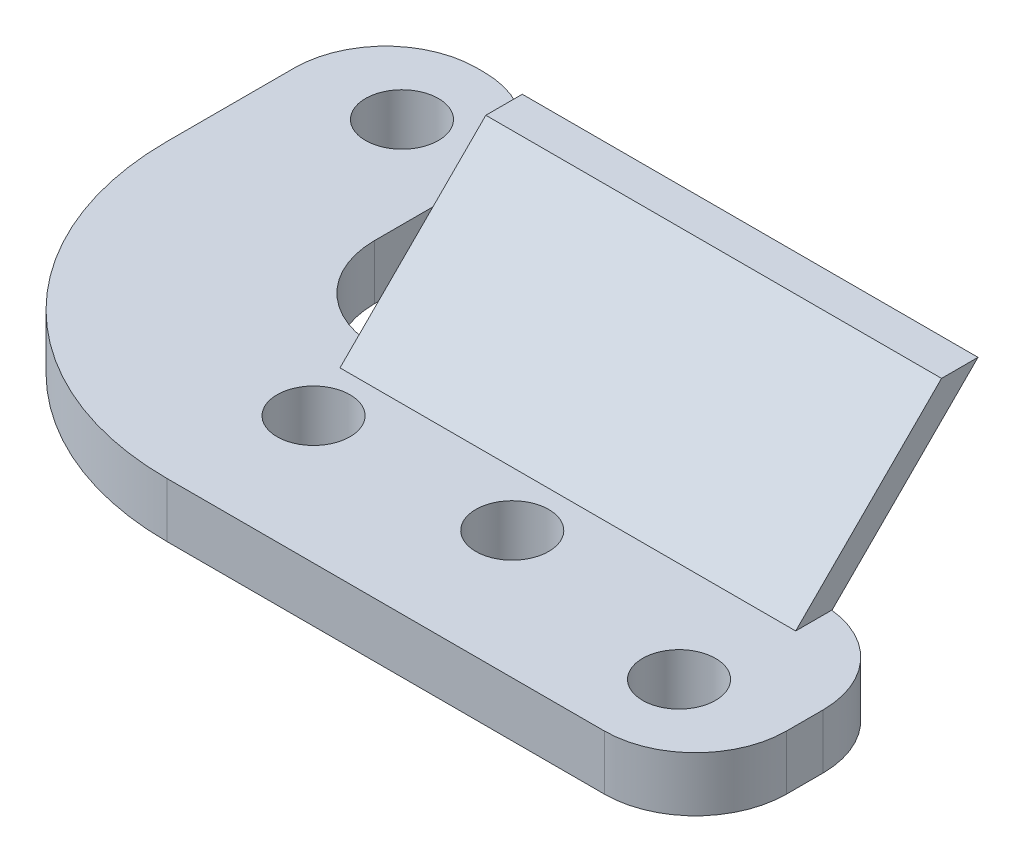
ISO-10303-21;
HEADER;
FILE_DESCRIPTION(('STEP AP214'),'2;1');
FILE_NAME('part.step','',(''),(''),'','','');
FILE_SCHEMA(('AUTOMOTIVE_DESIGN { 1 0 10303 214 1 1 1 1 }'));
ENDSEC;
DATA;
#1=APPLICATION_CONTEXT('core data for automotive mechanical design processes');
#2=APPLICATION_PROTOCOL_DEFINITION('international standard','automotive_design',2000,#1);
#3=PRODUCT_CONTEXT('',#1,'mechanical');
#4=PRODUCT('Part','Part','',(#3));
#5=PRODUCT_RELATED_PRODUCT_CATEGORY('part','',(#4));
#6=PRODUCT_DEFINITION_FORMATION('','',#4);
#7=PRODUCT_DEFINITION_CONTEXT('part definition',#1,'design');
#8=PRODUCT_DEFINITION('design','',#6,#7);
#9=PRODUCT_DEFINITION_SHAPE('','',#8);
#10=(LENGTH_UNIT() NAMED_UNIT(*) SI_UNIT(.MILLI.,.METRE.));
#11=(NAMED_UNIT(*) PLANE_ANGLE_UNIT() SI_UNIT($,.RADIAN.));
#12=(NAMED_UNIT(*) SI_UNIT($,.STERADIAN.) SOLID_ANGLE_UNIT());
#13=UNCERTAINTY_MEASURE_WITH_UNIT(LENGTH_MEASURE(1.E-05),#10,'distance_accuracy_value','');
#14=(GEOMETRIC_REPRESENTATION_CONTEXT(3) GLOBAL_UNCERTAINTY_ASSIGNED_CONTEXT((#13)) GLOBAL_UNIT_ASSIGNED_CONTEXT((#10,
#11,#12)) REPRESENTATION_CONTEXT('',''));
#15=CARTESIAN_POINT('',(0.,0.,0.));
#16=DIRECTION('',(0.,0.,1.));
#17=DIRECTION('',(1.,0.,0.));
#18=AXIS2_PLACEMENT_3D('',#15,#16,#17);
#19=CARTESIAN_POINT('',(-12.1,0.,2.00000000000001));
#20=DIRECTION('',(0.,0.,1.));
#21=DIRECTION('',(1.,0.,0.));
#22=AXIS2_PLACEMENT_3D('',#19,#20,#21);
#23=PLANE('',#22);
#24=DIRECTION('',(1.,0.,0.));
#25=VECTOR('',#24,1.);
#26=CARTESIAN_POINT('',(-7.,3.,2.00000000000001));
#27=LINE('',#26,#25);
#28=CARTESIAN_POINT('',(-7.,3.,2.00000000000001));
#29=VERTEX_POINT('',#28);
#30=CARTESIAN_POINT('',(-1.375813040851,3.,2.00000000000001));
#31=VERTEX_POINT('',#30);
#32=EDGE_CURVE('E82',#29,#31,#27,.T.);
#33=ORIENTED_EDGE('',*,*,#32,.T.);
#34=CARTESIAN_POINT('',(-1.375813040851,3.,2.00000000000001));
#35=CARTESIAN_POINT('',(-1.43730327936802,2.9467502376009,2.00000000000001));
#36=CARTESIAN_POINT('',(-1.49896624544466,2.89370015322512,2.00000000000001));
#37=CARTESIAN_POINT('',(-1.62269554283787,2.78806795498701,2.00000000000001));
#38=CARTESIAN_POINT('',(-1.68476188912119,2.7354858586621,2.00000000000001));
#39=CARTESIAN_POINT('',(-1.87176730969761,2.57844852926436,2.00000000000001));
#40=CARTESIAN_POINT('',(-1.99739320548546,2.47480625783929,2.00000000000001));
#41=CARTESIAN_POINT('',(-2.25565181792562,2.26685375995626,2.00000000000001));
#42=CARTESIAN_POINT('',(-2.38837387775181,2.16265411093397,2.00000000000001));
#43=CARTESIAN_POINT('',(-2.6573767435479,1.95900296490191,2.00000000000001));
#44=CARTESIAN_POINT('',(-2.79365608174645,1.85954955599163,2.00000000000001));
#45=CARTESIAN_POINT('',(-3.01361588240625,1.70775774880954,2.00000000000001));
#46=CARTESIAN_POINT('',(-3.09562812177616,1.65301023933813,2.00000000000001));
#47=CARTESIAN_POINT('',(-3.26180234747498,1.54682957224514,2.00000000000001));
#48=CARTESIAN_POINT('',(-3.34596458259755,1.49539680064729,2.00000000000001));
#49=CARTESIAN_POINT('',(-3.51563898672004,1.39769989904045,2.00000000000001));
#50=CARTESIAN_POINT('',(-3.60111389872318,1.35137164926032,2.00000000000001));
#51=CARTESIAN_POINT('',(-3.77503341759313,1.26457361944343,2.00000000000001));
#52=CARTESIAN_POINT('',(-3.86347774711878,1.22410329414625,2.00000000000001));
#53=CARTESIAN_POINT('',(-4.02321455226724,1.15938694586495,2.00000000000001));
#54=CARTESIAN_POINT('',(-4.09385302884763,1.13354247541662,2.00000000000001));
#55=CARTESIAN_POINT('',(-4.23697720310679,1.08780784222922,2.00000000000001));
#56=CARTESIAN_POINT('',(-4.30946084039725,1.06791132915132,2.00000000000001));
#57=CARTESIAN_POINT('',(-4.4576044312165,1.03490924589325,2.00000000000001));
#58=CARTESIAN_POINT('',(-4.53329911076626,1.02195443334035,2.00000000000001));
#59=CARTESIAN_POINT('',(-4.64769742110917,1.0088551409767,2.00000000000001));
#60=CARTESIAN_POINT('',(-4.68605474313612,1.00554394956792,2.00000000000001));
#61=CARTESIAN_POINT('',(-4.76290984945479,1.00111282569035,2.00000000000001));
#62=CARTESIAN_POINT('',(-4.80140768145761,0.999993723900384,2.00000000000001));
#63=CARTESIAN_POINT('',(-4.8399146559888,0.999999999999985,2.00000000000001));
#64=B_SPLINE_CURVE_WITH_KNOTS('',3,(#34,#35,#36,#37,#38,#39,#40,#41,#42,#43,#44,#45,#46,#47,#48,
#49,#50,#51,#52,#53,#54,#55,#56,#57,#58,#59,#60,#61,#62,#63),.UNSPECIFIED.,.F.,.F.,(4,2,2,2,2,2,
2,2,2,2,2,2,2,2,4),(0.,0.244026124703903,0.488061355871686,0.976607160337992,1.48276241738857,
1.98871203141778,2.28447498290611,2.58027231598975,2.87178153626228,3.16326360514428,
3.38870589795084,3.6139066304692,3.8438180738404,3.95926195802243,4.07474958049561),.UNSPECIFIED.);
#65=CARTESIAN_POINT('',(-4.8399146559888,0.999999999999986,2.00000000000001));
#66=VERTEX_POINT('',#65);
#67=EDGE_CURVE('E52',#31,#66,#64,.T.);
#68=ORIENTED_EDGE('',*,*,#67,.T.);
#69=DIRECTION('',(0.,1.,0.));
#70=VECTOR('',#69,1.);
#71=CARTESIAN_POINT('',(-4.8399146559888,0.,2.00000000000001));
#72=LINE('',#71,#70);
#73=CARTESIAN_POINT('',(-4.8399146559888,0.,2.00000000000001));
#74=VERTEX_POINT('',#73);
#75=EDGE_CURVE('E107',#66,#74,#72,.F.);
#76=ORIENTED_EDGE('',*,*,#75,.T.);
#77=DIRECTION('',(1.,0.,0.));
#78=VECTOR('',#77,1.);
#79=CARTESIAN_POINT('',(-12.1,0.,2.00000000000001));
#80=LINE('',#79,#78);
#81=CARTESIAN_POINT('',(-7.1,0.,2.00000000000001));
#82=VERTEX_POINT('',#81);
#83=EDGE_CURVE('E570',#82,#74,#80,.T.);
#84=ORIENTED_EDGE('',*,*,#83,.F.);
#85=DIRECTION('',(0.,1.,0.));
#86=VECTOR('',#85,1.);
#87=CARTESIAN_POINT('',(-7.1,3.,2.00000000000001));
#88=LINE('',#87,#86);
#89=CARTESIAN_POINT('',(-7.1,3.,2.00000000000001));
#90=VERTEX_POINT('',#89);
#91=EDGE_CURVE('E500',#82,#90,#88,.T.);
#92=ORIENTED_EDGE('',*,*,#91,.T.);
#93=DIRECTION('',(1.,0.,0.));
#94=VECTOR('',#93,1.);
#95=CARTESIAN_POINT('',(-12.1,3.,2.00000000000001));
#96=LINE('',#95,#94);
#97=EDGE_CURVE('E571',#90,#29,#96,.T.);
#98=ORIENTED_EDGE('',*,*,#97,.T.);
#99=EDGE_LOOP('',(#33,#68,#76,#84,#92,#98));
#100=FACE_BOUND('',#99,.T.);
#101=ADVANCED_FACE('F37',(#100),#23,.F.);
#102=CARTESIAN_POINT('',(-22.5,3.,14.));
#103=DIRECTION('',(1.,0.,0.));
#104=DIRECTION('',(0.,0.,-1.));
#105=AXIS2_PLACEMENT_3D('',#102,#103,#104);
#106=PLANE('',#105);
#107=DIRECTION('',(0.,0.,1.));
#108=VECTOR('',#107,1.);
#109=CARTESIAN_POINT('',(-22.5,0.,14.));
#110=LINE('',#109,#108);
#111=CARTESIAN_POINT('',(-22.5,0.,-8.99999999999999));
#112=VERTEX_POINT('',#111);
#113=CARTESIAN_POINT('',(-22.5,0.,-2.));
#114=VERTEX_POINT('',#113);
#115=EDGE_CURVE('E533',#112,#114,#110,.T.);
#116=ORIENTED_EDGE('',*,*,#115,.T.);
#117=DIRECTION('',(0.,-1.,0.));
#118=VECTOR('',#117,1.);
#119=CARTESIAN_POINT('',(-22.5,3.,-2.));
#120=LINE('',#119,#118);
#121=CARTESIAN_POINT('',(-22.5,3.,-2.));
#122=VERTEX_POINT('',#121);
#123=EDGE_CURVE('E453',#114,#122,#120,.F.);
#124=ORIENTED_EDGE('',*,*,#123,.T.);
#125=DIRECTION('',(0.,0.,1.));
#126=VECTOR('',#125,1.);
#127=CARTESIAN_POINT('',(-22.5,3.,14.));
#128=LINE('',#127,#126);
#129=CARTESIAN_POINT('',(-22.5,3.,-8.99999999999999));
#130=VERTEX_POINT('',#129);
#131=EDGE_CURVE('E526',#130,#122,#128,.T.);
#132=ORIENTED_EDGE('',*,*,#131,.F.);
#133=DIRECTION('',(0.,-1.,0.));
#134=VECTOR('',#133,1.);
#135=CARTESIAN_POINT('',(-22.5,3.,-8.99999999999999));
#136=LINE('',#135,#134);
#137=EDGE_CURVE('E480',#130,#112,#136,.T.);
#138=ORIENTED_EDGE('',*,*,#137,.T.);
#139=EDGE_LOOP('',(#116,#124,#132,#138));
#140=FACE_BOUND('',#139,.T.);
#141=ADVANCED_FACE('F223',(#140),#106,.F.);
#142=CARTESIAN_POINT('',(22.5,3.,14.));
#143=DIRECTION('',(0.,0.,-1.));
#144=DIRECTION('',(-1.,0.,0.));
#145=AXIS2_PLACEMENT_3D('',#142,#143,#144);
#146=PLANE('',#145);
#147=DIRECTION('',(1.,0.,0.));
#148=VECTOR('',#147,1.);
#149=CARTESIAN_POINT('',(22.5,3.,14.));
#150=LINE('',#149,#148);
#151=CARTESIAN_POINT('',(-6.49999999999998,3.,14.));
#152=VERTEX_POINT('',#151);
#153=CARTESIAN_POINT('',(17.5,3.,14.));
#154=VERTEX_POINT('',#153);
#155=EDGE_CURVE('E542',#152,#154,#150,.T.);
#156=ORIENTED_EDGE('',*,*,#155,.F.);
#157=DIRECTION('',(0.,-1.,0.));
#158=VECTOR('',#157,1.);
#159=CARTESIAN_POINT('',(-6.49999999999999,3.,14.));
#160=LINE('',#159,#158);
#161=CARTESIAN_POINT('',(-6.49999999999998,0.,14.));
#162=VERTEX_POINT('',#161);
#163=EDGE_CURVE('E459',#152,#162,#160,.T.);
#164=ORIENTED_EDGE('',*,*,#163,.T.);
#165=DIRECTION('',(1.,0.,0.));
#166=VECTOR('',#165,1.);
#167=CARTESIAN_POINT('',(22.5,0.,14.));
#168=LINE('',#167,#166);
#169=CARTESIAN_POINT('',(17.5,0.,14.));
#170=VERTEX_POINT('',#169);
#171=EDGE_CURVE('E530',#162,#170,#168,.T.);
#172=ORIENTED_EDGE('',*,*,#171,.T.);
#173=DIRECTION('',(0.,-1.,0.));
#174=VECTOR('',#173,1.);
#175=CARTESIAN_POINT('',(17.5,3.,14.));
#176=LINE('',#175,#174);
#177=EDGE_CURVE('E483',#170,#154,#176,.F.);
#178=ORIENTED_EDGE('',*,*,#177,.T.);
#179=EDGE_LOOP('',(#156,#164,#172,#178));
#180=FACE_BOUND('',#179,.T.);
#181=ADVANCED_FACE('F226',(#180),#146,.F.);
#182=CARTESIAN_POINT('',(22.5,3.,14.));
#183=DIRECTION('',(-1.,0.,0.));
#184=DIRECTION('',(0.,0.,1.));
#185=AXIS2_PLACEMENT_3D('',#182,#183,#184);
#186=PLANE('',#185);
#187=DIRECTION('',(0.,0.,-1.));
#188=VECTOR('',#187,1.);
#189=CARTESIAN_POINT('',(22.5,0.,14.));
#190=LINE('',#189,#188);
#191=CARTESIAN_POINT('',(22.5,0.,9.));
#192=VERTEX_POINT('',#191);
#193=CARTESIAN_POINT('',(22.5,0.,7.00000000000001));
#194=VERTEX_POINT('',#193);
#195=EDGE_CURVE('E527',#192,#194,#190,.T.);
#196=ORIENTED_EDGE('',*,*,#195,.T.);
#197=DIRECTION('',(0.,1.,0.));
#198=VECTOR('',#197,1.);
#199=CARTESIAN_POINT('',(22.5,3.,7.00000000000001));
#200=LINE('',#199,#198);
#201=CARTESIAN_POINT('',(22.5,3.,7.00000000000001));
#202=VERTEX_POINT('',#201);
#203=EDGE_CURVE('E516',#194,#202,#200,.T.);
#204=ORIENTED_EDGE('',*,*,#203,.T.);
#205=DIRECTION('',(0.,0.,-1.));
#206=VECTOR('',#205,1.);
#207=CARTESIAN_POINT('',(22.5,3.,14.));
#208=LINE('',#207,#206);
#209=CARTESIAN_POINT('',(22.5,3.,9.));
#210=VERTEX_POINT('',#209);
#211=EDGE_CURVE('E539',#210,#202,#208,.T.);
#212=ORIENTED_EDGE('',*,*,#211,.F.);
#213=DIRECTION('',(0.,-1.,0.));
#214=VECTOR('',#213,1.);
#215=CARTESIAN_POINT('',(22.5,3.,9.));
#216=LINE('',#215,#214);
#217=EDGE_CURVE('E519',#210,#192,#216,.T.);
#218=ORIENTED_EDGE('',*,*,#217,.T.);
#219=EDGE_LOOP('',(#196,#204,#212,#218));
#220=FACE_BOUND('',#219,.T.);
#221=ADVANCED_FACE('F230',(#220),#186,.F.);
#222=CARTESIAN_POINT('',(22.5,3.,-14.));
#223=DIRECTION('',(0.,0.,1.));
#224=DIRECTION('',(1.,0.,0.));
#225=AXIS2_PLACEMENT_3D('',#222,#223,#224);
#226=PLANE('',#225);
#227=DIRECTION('',(-1.,0.,0.));
#228=VECTOR('',#227,1.);
#229=CARTESIAN_POINT('',(22.5,0.,-14.));
#230=LINE('',#229,#228);
#231=CARTESIAN_POINT('',(-17.1,0.,-14.));
#232=VERTEX_POINT('',#231);
#233=CARTESIAN_POINT('',(-17.5,0.,-14.));
#234=VERTEX_POINT('',#233);
#235=EDGE_CURVE('E523',#232,#234,#230,.T.);
#236=ORIENTED_EDGE('',*,*,#235,.T.);
#237=DIRECTION('',(0.,-1.,0.));
#238=VECTOR('',#237,1.);
#239=CARTESIAN_POINT('',(-17.5,3.,-14.));
#240=LINE('',#239,#238);
#241=CARTESIAN_POINT('',(-17.5,3.,-14.));
#242=VERTEX_POINT('',#241);
#243=EDGE_CURVE('E474',#234,#242,#240,.F.);
#244=ORIENTED_EDGE('',*,*,#243,.T.);
#245=DIRECTION('',(-1.,0.,0.));
#246=VECTOR('',#245,1.);
#247=CARTESIAN_POINT('',(22.5,3.,-14.));
#248=LINE('',#247,#246);
#249=CARTESIAN_POINT('',(-17.1,3.,-14.));
#250=VERTEX_POINT('',#249);
#251=EDGE_CURVE('E522',#250,#242,#248,.T.);
#252=ORIENTED_EDGE('',*,*,#251,.F.);
#253=DIRECTION('',(0.,1.,0.));
#254=VECTOR('',#253,1.);
#255=CARTESIAN_POINT('',(-17.1,3.,-14.));
#256=LINE('',#255,#254);
#257=EDGE_CURVE('E477',#250,#232,#256,.F.);
#258=ORIENTED_EDGE('',*,*,#257,.T.);
#259=EDGE_LOOP('',(#236,#244,#252,#258));
#260=FACE_BOUND('',#259,.T.);
#261=ADVANCED_FACE('F234',(#260),#226,.F.);
#262=CARTESIAN_POINT('',(0.,3.,0.));
#263=DIRECTION('',(0.,1.,0.));
#264=DIRECTION('',(0.,0.,1.));
#265=AXIS2_PLACEMENT_3D('',#262,#263,#264);
#266=PLANE('',#265);
#267=DIRECTION('',(0.,0.,-1.));
#268=VECTOR('',#267,1.);
#269=CARTESIAN_POINT('',(18.,3.,2.00000000000001));
#270=LINE('',#269,#268);
#271=CARTESIAN_POINT('',(18.,3.,4.00000000000001));
#272=VERTEX_POINT('',#271);
#273=CARTESIAN_POINT('',(18.,3.,2.0250628144669));
#274=VERTEX_POINT('',#273);
#275=EDGE_CURVE('E601',#272,#274,#270,.T.);
#276=ORIENTED_EDGE('',*,*,#275,.F.);
#277=DIRECTION('',(1.,0.,0.));
#278=VECTOR('',#277,1.);
#279=CARTESIAN_POINT('',(-7.,3.,4.00000000000001));
#280=LINE('',#279,#278);
#281=CARTESIAN_POINT('',(-7.,3.,4.00000000000001));
#282=VERTEX_POINT('',#281);
#283=EDGE_CURVE('E577',#282,#272,#280,.T.);
#284=ORIENTED_EDGE('',*,*,#283,.F.);
#285=DIRECTION('',(0.,0.,-1.));
#286=VECTOR('',#285,1.);
#287=CARTESIAN_POINT('',(-7.,3.,2.00000000000001));
#288=LINE('',#287,#286);
#289=EDGE_CURVE('E594',#282,#29,#288,.T.);
#290=ORIENTED_EDGE('',*,*,#289,.T.);
#291=ORIENTED_EDGE('',*,*,#97,.F.);
#292=CARTESIAN_POINT('',(-7.1,3.,-2.99999999999999));
#293=DIRECTION('',(0.,1.,0.));
#294=DIRECTION('',(0.,0.,1.));
#295=AXIS2_PLACEMENT_3D('',#292,#293,#294);
#296=CIRCLE('',#295,5.);
#297=CARTESIAN_POINT('',(-12.1,3.,-3.));
#298=VERTEX_POINT('',#297);
#299=EDGE_CURVE('E465',#90,#298,#296,.F.);
#300=ORIENTED_EDGE('',*,*,#299,.T.);
#301=DIRECTION('',(0.,0.,1.));
#302=VECTOR('',#301,1.);
#303=CARTESIAN_POINT('',(-12.1,3.,-14.));
#304=LINE('',#303,#302);
#305=CARTESIAN_POINT('',(-12.1,3.,-8.99999999999999));
#306=VERTEX_POINT('',#305);
#307=EDGE_CURVE('E574',#306,#298,#304,.T.);
#308=ORIENTED_EDGE('',*,*,#307,.F.);
#309=CARTESIAN_POINT('',(-17.1,3.,-8.99999999999999));
#310=DIRECTION('',(0.,1.,0.));
#311=DIRECTION('',(0.,0.,1.));
#312=AXIS2_PLACEMENT_3D('',#309,#310,#311);
#313=CIRCLE('',#312,5.);
#314=EDGE_CURVE('E513',#306,#250,#313,.T.);
#315=ORIENTED_EDGE('',*,*,#314,.T.);
#316=ORIENTED_EDGE('',*,*,#251,.T.);
#317=CARTESIAN_POINT('',(-17.5,3.,-8.99999999999999));
#318=DIRECTION('',(0.,1.,0.));
#319=DIRECTION('',(0.,0.,1.));
#320=AXIS2_PLACEMENT_3D('',#317,#318,#319);
#321=CIRCLE('',#320,5.);
#322=EDGE_CURVE('E510',#242,#130,#321,.T.);
#323=ORIENTED_EDGE('',*,*,#322,.T.);
#324=ORIENTED_EDGE('',*,*,#131,.T.);
#325=CARTESIAN_POINT('',(-6.5,3.,-2.));
#326=DIRECTION('',(0.,1.,0.));
#327=DIRECTION('',(0.,0.,1.));
#328=AXIS2_PLACEMENT_3D('',#325,#326,#327);
#329=CIRCLE('',#328,16.);
#330=EDGE_CURVE('E121',#122,#152,#329,.T.);
#331=ORIENTED_EDGE('',*,*,#330,.T.);
#332=ORIENTED_EDGE('',*,*,#155,.T.);
#333=CARTESIAN_POINT('',(17.5,3.,9.));
#334=DIRECTION('',(0.,1.,0.));
#335=DIRECTION('',(0.,0.,1.));
#336=AXIS2_PLACEMENT_3D('',#333,#334,#335);
#337=CIRCLE('',#336,5.);
#338=EDGE_CURVE('E507',#154,#210,#337,.T.);
#339=ORIENTED_EDGE('',*,*,#338,.T.);
#340=ORIENTED_EDGE('',*,*,#211,.T.);
#341=CARTESIAN_POINT('',(17.5,3.,7.00000000000001));
#342=DIRECTION('',(0.,1.,0.));
#343=DIRECTION('',(0.,0.,1.));
#344=AXIS2_PLACEMENT_3D('',#341,#342,#343);
#345=CIRCLE('',#344,5.);
#346=EDGE_CURVE('E503',#202,#274,#345,.T.);
#347=ORIENTED_EDGE('',*,*,#346,.T.);
#348=EDGE_LOOP('',(#276,#284,#290,#291,#300,#308,#315,#316,#323,#324,#331,#332,#339,#340,#347));
#349=FACE_BOUND('',#348,.T.);
#350=CARTESIAN_POINT('',(-5.45,3.,7.00000000000001));
#351=DIRECTION('',(0.,1.,0.));
#352=DIRECTION('',(0.,0.,1.));
#353=AXIS2_PLACEMENT_3D('',#350,#351,#352);
#354=CIRCLE('',#353,1.99999999999999);
#355=CARTESIAN_POINT('',(-5.45,3.,8.99999999999999));
#356=VERTEX_POINT('',#355);
#357=EDGE_CURVE('E567',#356,#356,#354,.T.);
#358=ORIENTED_EDGE('',*,*,#357,.F.);
#359=EDGE_LOOP('',(#358));
#360=FACE_BOUND('',#359,.T.);
#361=CARTESIAN_POINT('',(5.45,3.,7.));
#362=DIRECTION('',(0.,1.,0.));
#363=DIRECTION('',(0.,0.,1.));
#364=AXIS2_PLACEMENT_3D('',#361,#362,#363);
#365=CIRCLE('',#364,1.99999999999999);
#366=CARTESIAN_POINT('',(5.45,3.,8.99999999999999));
#367=VERTEX_POINT('',#366);
#368=EDGE_CURVE('E561',#367,#367,#365,.T.);
#369=ORIENTED_EDGE('',*,*,#368,.F.);
#370=EDGE_LOOP('',(#369));
#371=FACE_BOUND('',#370,.T.);
#372=CARTESIAN_POINT('',(-17.1,3.,-9.5));
#373=DIRECTION('',(0.,1.,0.));
#374=DIRECTION('',(0.,0.,1.));
#375=AXIS2_PLACEMENT_3D('',#372,#373,#374);
#376=CIRCLE('',#375,1.99999999999999);
#377=CARTESIAN_POINT('',(-17.1,3.,-7.50000000000001));
#378=VERTEX_POINT('',#377);
#379=EDGE_CURVE('E555',#378,#378,#376,.T.);
#380=ORIENTED_EDGE('',*,*,#379,.F.);
#381=EDGE_LOOP('',(#380));
#382=FACE_BOUND('',#381,.T.);
#383=CARTESIAN_POINT('',(17.1,3.,9.49999999999999));
#384=DIRECTION('',(0.,1.,0.));
#385=DIRECTION('',(0.,0.,1.));
#386=AXIS2_PLACEMENT_3D('',#383,#384,#385);
#387=CIRCLE('',#386,1.99999999999999);
#388=CARTESIAN_POINT('',(17.1,3.,11.5));
#389=VERTEX_POINT('',#388);
#390=EDGE_CURVE('E549',#389,#389,#387,.T.);
#391=ORIENTED_EDGE('',*,*,#390,.F.);
#392=EDGE_LOOP('',(#391));
#393=FACE_BOUND('',#392,.T.);
#394=ADVANCED_FACE('F238',(#349,#360,#371,#382,#393),#266,.T.);
#395=CARTESIAN_POINT('',(0.,0.,0.));
#396=DIRECTION('',(0.,1.,0.));
#397=DIRECTION('',(0.,0.,1.));
#398=AXIS2_PLACEMENT_3D('',#395,#396,#397);
#399=PLANE('',#398);
#400=CARTESIAN_POINT('',(-5.45,0.,7.00000000000001));
#401=DIRECTION('',(0.,1.,0.));
#402=DIRECTION('',(0.,0.,1.));
#403=AXIS2_PLACEMENT_3D('',#400,#401,#402);
#404=CIRCLE('',#403,2.);
#405=CARTESIAN_POINT('',(-5.45,0.,9.00000000000001));
#406=VERTEX_POINT('',#405);
#407=EDGE_CURVE('E564',#406,#406,#404,.T.);
#408=ORIENTED_EDGE('',*,*,#407,.T.);
#409=EDGE_LOOP('',(#408));
#410=FACE_BOUND('',#409,.T.);
#411=CARTESIAN_POINT('',(5.45,0.,7.));
#412=DIRECTION('',(0.,1.,0.));
#413=DIRECTION('',(0.,0.,1.));
#414=AXIS2_PLACEMENT_3D('',#411,#412,#413);
#415=CIRCLE('',#414,2.);
#416=CARTESIAN_POINT('',(5.45,0.,9.));
#417=VERTEX_POINT('',#416);
#418=EDGE_CURVE('E558',#417,#417,#415,.T.);
#419=ORIENTED_EDGE('',*,*,#418,.T.);
#420=EDGE_LOOP('',(#419));
#421=FACE_BOUND('',#420,.T.);
#422=CARTESIAN_POINT('',(-17.1,0.,-9.5));
#423=DIRECTION('',(0.,1.,0.));
#424=DIRECTION('',(0.,0.,1.));
#425=AXIS2_PLACEMENT_3D('',#422,#423,#424);
#426=CIRCLE('',#425,2.);
#427=CARTESIAN_POINT('',(-17.1,0.,-7.5));
#428=VERTEX_POINT('',#427);
#429=EDGE_CURVE('E552',#428,#428,#426,.T.);
#430=ORIENTED_EDGE('',*,*,#429,.T.);
#431=EDGE_LOOP('',(#430));
#432=FACE_BOUND('',#431,.T.);
#433=CARTESIAN_POINT('',(17.1,0.,9.49999999999999));
#434=DIRECTION('',(0.,1.,0.));
#435=DIRECTION('',(0.,0.,1.));
#436=AXIS2_PLACEMENT_3D('',#433,#434,#435);
#437=CIRCLE('',#436,2.);
#438=CARTESIAN_POINT('',(17.1,0.,11.5));
#439=VERTEX_POINT('',#438);
#440=EDGE_CURVE('E536',#439,#439,#437,.T.);
#441=ORIENTED_EDGE('',*,*,#440,.T.);
#442=EDGE_LOOP('',(#441));
#443=FACE_BOUND('',#442,.T.);
#444=ORIENTED_EDGE('',*,*,#83,.T.);
#445=CARTESIAN_POINT('',(-4.8399146559888,0.,4.00000000000001));
#446=DIRECTION('',(0.,1.,0.));
#447=DIRECTION('',(0.,0.,1.));
#448=AXIS2_PLACEMENT_3D('',#445,#446,#447);
#449=CIRCLE('',#448,2.);
#450=CARTESIAN_POINT('',(-2.90342298288509,0.,3.50000000000001));
#451=VERTEX_POINT('',#450);
#452=EDGE_CURVE('E119',#74,#451,#449,.F.);
#453=ORIENTED_EDGE('',*,*,#452,.T.);
#454=DIRECTION('',(-1.,0.,0.));
#455=VECTOR('',#454,1.);
#456=CARTESIAN_POINT('',(-2.90342298288509,0.,3.50000000000001));
#457=LINE('',#456,#455);
#458=CARTESIAN_POINT('',(14.5171149144254,0.,3.50000000000001));
#459=VERTEX_POINT('',#458);
#460=EDGE_CURVE('E622',#459,#451,#457,.T.);
#461=ORIENTED_EDGE('',*,*,#460,.F.);
#462=CARTESIAN_POINT('',(16.4536065875291,0.,4.00000000000001));
#463=DIRECTION('',(0.,1.,0.));
#464=DIRECTION('',(0.,0.,1.));
#465=AXIS2_PLACEMENT_3D('',#462,#463,#464);
#466=CIRCLE('',#465,2.);
#467=CARTESIAN_POINT('',(16.4536065875291,0.,2.00000000000001));
#468=VERTEX_POINT('',#467);
#469=EDGE_CURVE('E94',#459,#468,#466,.F.);
#470=ORIENTED_EDGE('',*,*,#469,.T.);
#471=CARTESIAN_POINT('',(17.5,0.,2.00000000000001));
#472=VERTEX_POINT('',#471);
#473=EDGE_CURVE('E446',#468,#472,#80,.T.);
#474=ORIENTED_EDGE('',*,*,#473,.T.);
#475=CARTESIAN_POINT('',(17.5,0.,7.00000000000001));
#476=DIRECTION('',(0.,1.,0.));
#477=DIRECTION('',(0.,0.,1.));
#478=AXIS2_PLACEMENT_3D('',#475,#476,#477);
#479=CIRCLE('',#478,5.);
#480=EDGE_CURVE('E486',#472,#194,#479,.F.);
#481=ORIENTED_EDGE('',*,*,#480,.T.);
#482=ORIENTED_EDGE('',*,*,#195,.F.);
#483=CARTESIAN_POINT('',(17.5,0.,9.));
#484=DIRECTION('',(0.,1.,0.));
#485=DIRECTION('',(0.,0.,1.));
#486=AXIS2_PLACEMENT_3D('',#483,#484,#485);
#487=CIRCLE('',#486,5.);
#488=EDGE_CURVE('E489',#192,#170,#487,.F.);
#489=ORIENTED_EDGE('',*,*,#488,.T.);
#490=ORIENTED_EDGE('',*,*,#171,.F.);
#491=CARTESIAN_POINT('',(-6.5,0.,-2.));
#492=DIRECTION('',(0.,1.,0.));
#493=DIRECTION('',(0.,0.,1.));
#494=AXIS2_PLACEMENT_3D('',#491,#492,#493);
#495=CIRCLE('',#494,16.);
#496=EDGE_CURVE('E456',#162,#114,#495,.F.);
#497=ORIENTED_EDGE('',*,*,#496,.T.);
#498=ORIENTED_EDGE('',*,*,#115,.F.);
#499=CARTESIAN_POINT('',(-17.5,0.,-8.99999999999999));
#500=DIRECTION('',(0.,1.,0.));
#501=DIRECTION('',(0.,0.,1.));
#502=AXIS2_PLACEMENT_3D('',#499,#500,#501);
#503=CIRCLE('',#502,5.);
#504=EDGE_CURVE('E492',#112,#234,#503,.F.);
#505=ORIENTED_EDGE('',*,*,#504,.T.);
#506=ORIENTED_EDGE('',*,*,#235,.F.);
#507=CARTESIAN_POINT('',(-17.1,0.,-8.99999999999999));
#508=DIRECTION('',(0.,1.,0.));
#509=DIRECTION('',(0.,0.,1.));
#510=AXIS2_PLACEMENT_3D('',#507,#508,#509);
#511=CIRCLE('',#510,5.);
#512=CARTESIAN_POINT('',(-12.1,0.,-8.99999999999999));
#513=VERTEX_POINT('',#512);
#514=EDGE_CURVE('E495',#232,#513,#511,.F.);
#515=ORIENTED_EDGE('',*,*,#514,.T.);
#516=DIRECTION('',(0.,0.,1.));
#517=VECTOR('',#516,1.);
#518=CARTESIAN_POINT('',(-12.1,0.,-14.));
#519=LINE('',#518,#517);
#520=CARTESIAN_POINT('',(-12.1,0.,-3.));
#521=VERTEX_POINT('',#520);
#522=EDGE_CURVE('E573',#513,#521,#519,.T.);
#523=ORIENTED_EDGE('',*,*,#522,.T.);
#524=CARTESIAN_POINT('',(-7.1,0.,-2.99999999999999));
#525=DIRECTION('',(0.,1.,0.));
#526=DIRECTION('',(0.,0.,1.));
#527=AXIS2_PLACEMENT_3D('',#524,#525,#526);
#528=CIRCLE('',#527,5.);
#529=EDGE_CURVE('E462',#521,#82,#528,.T.);
#530=ORIENTED_EDGE('',*,*,#529,.T.);
#531=EDGE_LOOP('',(#444,#453,#461,#470,#474,#481,#482,#489,#490,#497,#498,#505,#506,#515,#523,#530));
#532=FACE_BOUND('',#531,.T.);
#533=ADVANCED_FACE('F240',(#410,#421,#432,#443,#532),#399,.F.);
#534=CARTESIAN_POINT('',(17.1,3.,9.49999999999999));
#535=DIRECTION('',(0.,1.,0.));
#536=DIRECTION('',(0.,0.,1.));
#537=AXIS2_PLACEMENT_3D('',#534,#535,#536);
#538=CYLINDRICAL_SURFACE('',#537,1.99999999999999);
#539=ORIENTED_EDGE('',*,*,#440,.F.);
#540=EDGE_LOOP('',(#539));
#541=FACE_BOUND('',#540,.T.);
#542=ORIENTED_EDGE('',*,*,#390,.T.);
#543=EDGE_LOOP('',(#542));
#544=FACE_BOUND('',#543,.T.);
#545=ADVANCED_FACE('F243',(#541,#544),#538,.F.);
#546=CARTESIAN_POINT('',(-17.1,3.,-9.5));
#547=DIRECTION('',(0.,1.,0.));
#548=DIRECTION('',(0.,0.,1.));
#549=AXIS2_PLACEMENT_3D('',#546,#547,#548);
#550=CYLINDRICAL_SURFACE('',#549,1.99999999999999);
#551=ORIENTED_EDGE('',*,*,#429,.F.);
#552=EDGE_LOOP('',(#551));
#553=FACE_BOUND('',#552,.T.);
#554=ORIENTED_EDGE('',*,*,#379,.T.);
#555=EDGE_LOOP('',(#554));
#556=FACE_BOUND('',#555,.T.);
#557=ADVANCED_FACE('F250',(#553,#556),#550,.F.);
#558=CARTESIAN_POINT('',(5.45,3.,7.));
#559=DIRECTION('',(0.,1.,0.));
#560=DIRECTION('',(0.,0.,1.));
#561=AXIS2_PLACEMENT_3D('',#558,#559,#560);
#562=CYLINDRICAL_SURFACE('',#561,1.99999999999999);
#563=ORIENTED_EDGE('',*,*,#418,.F.);
#564=EDGE_LOOP('',(#563));
#565=FACE_BOUND('',#564,.T.);
#566=ORIENTED_EDGE('',*,*,#368,.T.);
#567=EDGE_LOOP('',(#566));
#568=FACE_BOUND('',#567,.T.);
#569=ADVANCED_FACE('F254',(#565,#568),#562,.F.);
#570=CARTESIAN_POINT('',(-5.45,3.,7.00000000000001));
#571=DIRECTION('',(0.,1.,0.));
#572=DIRECTION('',(0.,0.,1.));
#573=AXIS2_PLACEMENT_3D('',#570,#571,#572);
#574=CYLINDRICAL_SURFACE('',#573,1.99999999999999);
#575=ORIENTED_EDGE('',*,*,#407,.F.);
#576=EDGE_LOOP('',(#575));
#577=FACE_BOUND('',#576,.T.);
#578=ORIENTED_EDGE('',*,*,#357,.T.);
#579=EDGE_LOOP('',(#578));
#580=FACE_BOUND('',#579,.T.);
#581=ADVANCED_FACE('F180',(#577,#580),#574,.F.);
#582=ORIENTED_EDGE('',*,*,#473,.F.);
#583=DIRECTION('',(0.,-1.,0.));
#584=VECTOR('',#583,1.);
#585=CARTESIAN_POINT('',(16.4536065875291,0.,2.00000000000001));
#586=LINE('',#585,#584);
#587=CARTESIAN_POINT('',(16.4536065875291,0.999999999999986,2.00000000000001));
#588=VERTEX_POINT('',#587);
#589=EDGE_CURVE('E445',#468,#588,#586,.F.);
#590=ORIENTED_EDGE('',*,*,#589,.T.);
#591=CARTESIAN_POINT('',(16.4536065875291,0.999999999999986,2.00000000000001));
#592=CARTESIAN_POINT('',(16.392041753582,0.999948234275501,2.00000000000001));
#593=CARTESIAN_POINT('',(16.3305089248502,1.00284144974072,2.00000000000001));
#594=CARTESIAN_POINT('',(16.2080703581087,1.01410897303336,2.00000000000001));
#595=CARTESIAN_POINT('',(16.1471635855697,1.02247192092794,2.00000000000001));
#596=CARTESIAN_POINT('',(16.0274107492228,1.04406950524873,2.00000000000001));
#597=CARTESIAN_POINT('',(15.968547444407,1.0572102185156,2.00000000000001));
#598=CARTESIAN_POINT('',(15.8519337207308,1.08778513260776,2.00000000000001));
#599=CARTESIAN_POINT('',(15.7941838532479,1.1052214045662,2.00000000000001));
#600=CARTESIAN_POINT('',(15.6120467536263,1.16664447584394,2.00000000000001));
#601=CARTESIAN_POINT('',(15.4899956518067,1.21756548474273,2.00000000000001));
#602=CARTESIAN_POINT('',(15.2514521355801,1.33111999069741,2.00000000000001));
#603=CARTESIAN_POINT('',(15.1349706502472,1.39377541792018,2.00000000000001));
#604=CARTESIAN_POINT('',(14.9041551488777,1.52820815395779,2.00000000000001));
#605=CARTESIAN_POINT('',(14.7899182306433,1.60014997312012,2.00000000000001));
#606=CARTESIAN_POINT('',(14.5651779262866,1.74938601411322,2.00000000000001));
#607=CARTESIAN_POINT('',(14.4546716638128,1.82667596548309,2.00000000000001));
#608=CARTESIAN_POINT('',(14.2256706558026,1.99280708912078,2.00000000000001));
#609=CARTESIAN_POINT('',(14.1074594906621,2.0820366263718,2.00000000000001));
#610=CARTESIAN_POINT('',(13.873476261411,2.26368707079329,2.00000000000001));
#611=CARTESIAN_POINT('',(13.7577049252552,2.35610890931643,2.00000000000001));
#612=CARTESIAN_POINT('',(13.5324546083419,2.5396351502846,2.00000000000001));
#613=CARTESIAN_POINT('',(13.4229049931215,2.63065323938846,2.00000000000001));
#614=CARTESIAN_POINT('',(13.2052381331944,2.81425915559797,2.00000000000001));
#615=CARTESIAN_POINT('',(13.0971200794086,2.90684602215262,2.00000000000001));
#616=CARTESIAN_POINT('',(12.9895049723913,3.,2.00000000000001));
#617=B_SPLINE_CURVE_WITH_KNOTS('',3,(#591,#592,#593,#594,#595,#596,#597,#598,#599,#600,#601,
#602,#603,#604,#605,#606,#607,#608,#609,#610,#611,#612,#613,#614,#615,#616),.UNSPECIFIED.,.F.,
.F.,(4,2,2,2,2,2,2,2,2,2,2,2,4),(0.,0.184575333762296,0.368768540317988,0.549520952738934,
0.730360687332563,1.12602877765823,1.52244383780022,1.92721918468235,2.33167496906158,
2.77591931243706,3.22029437723612,3.64755775641137,4.07456835675896),.UNSPECIFIED.);
#618=CARTESIAN_POINT('',(12.9895049723913,3.,2.00000000000001));
#619=VERTEX_POINT('',#618);
#620=EDGE_CURVE('E11',#588,#619,#617,.T.);
#621=ORIENTED_EDGE('',*,*,#620,.T.);
#622=CARTESIAN_POINT('',(17.5,3.,2.00000000000001));
#623=VERTEX_POINT('',#622);
#624=EDGE_CURVE('E59',#619,#623,#27,.T.);
#625=ORIENTED_EDGE('',*,*,#624,.T.);
#626=DIRECTION('',(0.,1.,0.));
#627=VECTOR('',#626,1.);
#628=CARTESIAN_POINT('',(17.5,0.,2.00000000000001));
#629=LINE('',#628,#627);
#630=EDGE_CURVE('E498',#623,#472,#629,.F.);
#631=ORIENTED_EDGE('',*,*,#630,.T.);
#632=EDGE_LOOP('',(#582,#590,#621,#625,#631));
#633=FACE_BOUND('',#632,.T.);
#634=ADVANCED_FACE('F175',(#633),#23,.F.);
#635=CARTESIAN_POINT('',(-12.1,0.,-14.));
#636=DIRECTION('',(-1.,0.,0.));
#637=DIRECTION('',(0.,0.,1.));
#638=AXIS2_PLACEMENT_3D('',#635,#636,#637);
#639=PLANE('',#638);
#640=ORIENTED_EDGE('',*,*,#522,.F.);
#641=DIRECTION('',(0.,1.,0.));
#642=VECTOR('',#641,1.);
#643=CARTESIAN_POINT('',(-12.1,0.,-8.99999999999999));
#644=LINE('',#643,#642);
#645=EDGE_CURVE('E468',#513,#306,#644,.T.);
#646=ORIENTED_EDGE('',*,*,#645,.T.);
#647=ORIENTED_EDGE('',*,*,#307,.T.);
#648=DIRECTION('',(0.,1.,0.));
#649=VECTOR('',#648,1.);
#650=CARTESIAN_POINT('',(-12.1,0.,-2.99999999999999));
#651=LINE('',#650,#649);
#652=EDGE_CURVE('E471',#298,#521,#651,.F.);
#653=ORIENTED_EDGE('',*,*,#652,.T.);
#654=EDGE_LOOP('',(#640,#646,#647,#653));
#655=FACE_BOUND('',#654,.T.);
#656=ADVANCED_FACE('F179',(#655),#639,.F.);
#657=CARTESIAN_POINT('',(17.5,3.,7.00000000000001));
#658=DIRECTION('',(0.,1.,0.));
#659=DIRECTION('',(0.,0.,1.));
#660=AXIS2_PLACEMENT_3D('',#657,#658,#659);
#661=CYLINDRICAL_SURFACE('',#660,5.);
#662=ORIENTED_EDGE('',*,*,#480,.F.);
#663=ORIENTED_EDGE('',*,*,#630,.F.);
#664=EDGE_CURVE('E506',#274,#623,#345,.T.);
#665=ORIENTED_EDGE('',*,*,#664,.F.);
#666=ORIENTED_EDGE('',*,*,#346,.F.);
#667=ORIENTED_EDGE('',*,*,#203,.F.);
#668=EDGE_LOOP('',(#662,#663,#665,#666,#667));
#669=FACE_BOUND('',#668,.T.);
#670=ADVANCED_FACE('F218',(#669),#661,.T.);
#671=CARTESIAN_POINT('',(17.5,3.,9.));
#672=DIRECTION('',(0.,-1.,0.));
#673=DIRECTION('',(0.,0.,-1.));
#674=AXIS2_PLACEMENT_3D('',#671,#672,#673);
#675=CYLINDRICAL_SURFACE('',#674,5.);
#676=ORIENTED_EDGE('',*,*,#338,.F.);
#677=ORIENTED_EDGE('',*,*,#177,.F.);
#678=ORIENTED_EDGE('',*,*,#488,.F.);
#679=ORIENTED_EDGE('',*,*,#217,.F.);
#680=EDGE_LOOP('',(#676,#677,#678,#679));
#681=FACE_BOUND('',#680,.T.);
#682=ADVANCED_FACE('F214',(#681),#675,.T.);
#683=CARTESIAN_POINT('',(-17.5,3.,-8.99999999999999));
#684=DIRECTION('',(0.,-1.,0.));
#685=DIRECTION('',(0.,0.,-1.));
#686=AXIS2_PLACEMENT_3D('',#683,#684,#685);
#687=CYLINDRICAL_SURFACE('',#686,5.);
#688=ORIENTED_EDGE('',*,*,#322,.F.);
#689=ORIENTED_EDGE('',*,*,#243,.F.);
#690=ORIENTED_EDGE('',*,*,#504,.F.);
#691=ORIENTED_EDGE('',*,*,#137,.F.);
#692=EDGE_LOOP('',(#688,#689,#690,#691));
#693=FACE_BOUND('',#692,.T.);
#694=ADVANCED_FACE('F210',(#693),#687,.T.);
#695=CARTESIAN_POINT('',(-17.1,0.,-8.99999999999999));
#696=DIRECTION('',(0.,1.,0.));
#697=DIRECTION('',(0.,0.,1.));
#698=AXIS2_PLACEMENT_3D('',#695,#696,#697);
#699=CYLINDRICAL_SURFACE('',#698,5.);
#700=ORIENTED_EDGE('',*,*,#514,.F.);
#701=ORIENTED_EDGE('',*,*,#257,.F.);
#702=ORIENTED_EDGE('',*,*,#314,.F.);
#703=ORIENTED_EDGE('',*,*,#645,.F.);
#704=EDGE_LOOP('',(#700,#701,#702,#703));
#705=FACE_BOUND('',#704,.T.);
#706=ADVANCED_FACE('F206',(#705),#699,.T.);
#707=CARTESIAN_POINT('',(-7.1,0.,-2.99999999999999));
#708=DIRECTION('',(0.,-1.,0.));
#709=DIRECTION('',(0.,0.,-1.));
#710=AXIS2_PLACEMENT_3D('',#707,#708,#709);
#711=CYLINDRICAL_SURFACE('',#710,5.);
#712=ORIENTED_EDGE('',*,*,#529,.F.);
#713=ORIENTED_EDGE('',*,*,#652,.F.);
#714=ORIENTED_EDGE('',*,*,#299,.F.);
#715=ORIENTED_EDGE('',*,*,#91,.F.);
#716=EDGE_LOOP('',(#712,#713,#714,#715));
#717=FACE_BOUND('',#716,.T.);
#718=ADVANCED_FACE('F202',(#717),#711,.F.);
#719=CARTESIAN_POINT('',(-6.5,3.,-2.));
#720=DIRECTION('',(0.,-1.,0.));
#721=DIRECTION('',(0.,0.,-1.));
#722=AXIS2_PLACEMENT_3D('',#719,#720,#721);
#723=CYLINDRICAL_SURFACE('',#722,16.);
#724=ORIENTED_EDGE('',*,*,#330,.F.);
#725=ORIENTED_EDGE('',*,*,#123,.F.);
#726=ORIENTED_EDGE('',*,*,#496,.F.);
#727=ORIENTED_EDGE('',*,*,#163,.F.);
#728=EDGE_LOOP('',(#724,#725,#726,#727));
#729=FACE_BOUND('',#728,.T.);
#730=ADVANCED_FACE('F173',(#729),#723,.T.);
#731=CARTESIAN_POINT('',(-7.,3.,2.00000000000001));
#732=DIRECTION('',(0.,-1.,0.));
#733=DIRECTION('',(0.,0.,-1.));
#734=AXIS2_PLACEMENT_3D('',#731,#732,#733);
#735=PLANE('',#734);
#736=CARTESIAN_POINT('',(18.,3.,2.00000000000001));
#737=VERTEX_POINT('',#736);
#738=EDGE_CURVE('E604',#274,#737,#270,.T.);
#739=ORIENTED_EDGE('',*,*,#738,.F.);
#740=ORIENTED_EDGE('',*,*,#664,.T.);
#741=EDGE_CURVE('E583',#623,#737,#27,.T.);
#742=ORIENTED_EDGE('',*,*,#741,.T.);
#743=EDGE_LOOP('',(#739,#740,#742));
#744=FACE_BOUND('',#743,.T.);
#745=ADVANCED_FACE('F165',(#744),#735,.T.);
#746=CARTESIAN_POINT('',(-7.,3.,4.00000000000001));
#747=DIRECTION('',(0.,0.707106781186551,0.707106781186544));
#748=DIRECTION('',(0.,-0.707106781186544,0.707106781186551));
#749=AXIS2_PLACEMENT_3D('',#746,#747,#748);
#750=PLANE('',#749);
#751=DIRECTION('',(0.,-0.707106781186544,0.707106781186551));
#752=VECTOR('',#751,1.);
#753=CARTESIAN_POINT('',(18.,3.,4.00000000000001));
#754=LINE('',#753,#752);
#755=CARTESIAN_POINT('',(18.,11.,-4.00000000000008));
#756=VERTEX_POINT('',#755);
#757=EDGE_CURVE('E591',#756,#272,#754,.T.);
#758=ORIENTED_EDGE('',*,*,#757,.F.);
#759=DIRECTION('',(1.,0.,0.));
#760=VECTOR('',#759,1.);
#761=CARTESIAN_POINT('',(-7.,11.,-4.00000000000008));
#762=LINE('',#761,#760);
#763=CARTESIAN_POINT('',(-7.,11.,-4.00000000000008));
#764=VERTEX_POINT('',#763);
#765=EDGE_CURVE('E586',#764,#756,#762,.T.);
#766=ORIENTED_EDGE('',*,*,#765,.F.);
#767=DIRECTION('',(0.,-0.707106781186544,0.707106781186551));
#768=VECTOR('',#767,1.);
#769=CARTESIAN_POINT('',(-7.,3.,4.00000000000001));
#770=LINE('',#769,#768);
#771=EDGE_CURVE('E605',#764,#282,#770,.T.);
#772=ORIENTED_EDGE('',*,*,#771,.T.);
#773=ORIENTED_EDGE('',*,*,#283,.T.);
#774=EDGE_LOOP('',(#758,#766,#772,#773));
#775=FACE_BOUND('',#774,.T.);
#776=ADVANCED_FACE('F161',(#775),#750,.T.);
#777=CARTESIAN_POINT('',(-7.,11.,-4.00000000000008));
#778=DIRECTION('',(0.,1.,0.));
#779=DIRECTION('',(0.,0.,1.));
#780=AXIS2_PLACEMENT_3D('',#777,#778,#779);
#781=PLANE('',#780);
#782=DIRECTION('',(0.,0.,1.));
#783=VECTOR('',#782,1.);
#784=CARTESIAN_POINT('',(18.,11.,-4.00000000000008));
#785=LINE('',#784,#783);
#786=CARTESIAN_POINT('',(18.,11.,-6.00000000000008));
#787=VERTEX_POINT('',#786);
#788=EDGE_CURVE('E595',#787,#756,#785,.T.);
#789=ORIENTED_EDGE('',*,*,#788,.F.);
#790=DIRECTION('',(1.,0.,0.));
#791=VECTOR('',#790,1.);
#792=CARTESIAN_POINT('',(-7.,11.,-6.00000000000008));
#793=LINE('',#792,#791);
#794=CARTESIAN_POINT('',(-7.,11.,-6.00000000000008));
#795=VERTEX_POINT('',#794);
#796=EDGE_CURVE('E582',#795,#787,#793,.T.);
#797=ORIENTED_EDGE('',*,*,#796,.F.);
#798=DIRECTION('',(0.,0.,1.));
#799=VECTOR('',#798,1.);
#800=CARTESIAN_POINT('',(-7.,11.,-4.00000000000008));
#801=LINE('',#800,#799);
#802=EDGE_CURVE('E608',#795,#764,#801,.T.);
#803=ORIENTED_EDGE('',*,*,#802,.T.);
#804=ORIENTED_EDGE('',*,*,#765,.T.);
#805=EDGE_LOOP('',(#789,#797,#803,#804));
#806=FACE_BOUND('',#805,.T.);
#807=ADVANCED_FACE('F164',(#806),#781,.T.);
#808=CARTESIAN_POINT('',(-7.,11.,-6.00000000000008));
#809=DIRECTION('',(0.,-0.707106781186551,-0.707106781186544));
#810=DIRECTION('',(0.,0.707106781186544,-0.707106781186551));
#811=AXIS2_PLACEMENT_3D('',#808,#809,#810);
#812=PLANE('',#811);
#813=DIRECTION('',(0.,0.707106781186544,-0.707106781186551));
#814=VECTOR('',#813,1.);
#815=CARTESIAN_POINT('',(18.,11.,-6.00000000000008));
#816=LINE('',#815,#814);
#817=EDGE_CURVE('E598',#737,#787,#816,.T.);
#818=ORIENTED_EDGE('',*,*,#817,.F.);
#819=ORIENTED_EDGE('',*,*,#741,.F.);
#820=ORIENTED_EDGE('',*,*,#624,.F.);
#821=DIRECTION('',(1.,0.,0.));
#822=VECTOR('',#821,1.);
#823=CARTESIAN_POINT('',(-2.90342298288509,3.,2.00000000000001));
#824=LINE('',#823,#822);
#825=EDGE_CURVE('E625',#31,#619,#824,.T.);
#826=ORIENTED_EDGE('',*,*,#825,.F.);
#827=ORIENTED_EDGE('',*,*,#32,.F.);
#828=DIRECTION('',(0.,0.707106781186544,-0.707106781186551));
#829=VECTOR('',#828,1.);
#830=CARTESIAN_POINT('',(-7.,11.,-6.00000000000008));
#831=LINE('',#830,#829);
#832=EDGE_CURVE('E611',#29,#795,#831,.T.);
#833=ORIENTED_EDGE('',*,*,#832,.T.);
#834=ORIENTED_EDGE('',*,*,#796,.T.);
#835=EDGE_LOOP('',(#818,#819,#820,#826,#827,#833,#834));
#836=FACE_BOUND('',#835,.T.);
#837=ADVANCED_FACE('F156',(#836),#812,.T.);
#838=CARTESIAN_POINT('',(-7.,0.,0.));
#839=DIRECTION('',(-1.,0.,0.));
#840=DIRECTION('',(0.,0.,1.));
#841=AXIS2_PLACEMENT_3D('',#838,#839,#840);
#842=PLANE('',#841);
#843=ORIENTED_EDGE('',*,*,#289,.F.);
#844=ORIENTED_EDGE('',*,*,#771,.F.);
#845=ORIENTED_EDGE('',*,*,#802,.F.);
#846=ORIENTED_EDGE('',*,*,#832,.F.);
#847=EDGE_LOOP('',(#843,#844,#845,#846));
#848=FACE_BOUND('',#847,.T.);
#849=ADVANCED_FACE('F152',(#848),#842,.T.);
#850=CARTESIAN_POINT('',(18.,0.,0.));
#851=DIRECTION('',(-1.,0.,0.));
#852=DIRECTION('',(0.,0.,1.));
#853=AXIS2_PLACEMENT_3D('',#850,#851,#852);
#854=PLANE('',#853);
#855=ORIENTED_EDGE('',*,*,#275,.T.);
#856=ORIENTED_EDGE('',*,*,#738,.T.);
#857=ORIENTED_EDGE('',*,*,#817,.T.);
#858=ORIENTED_EDGE('',*,*,#788,.T.);
#859=ORIENTED_EDGE('',*,*,#757,.T.);
#860=EDGE_LOOP('',(#855,#856,#857,#858,#859));
#861=FACE_BOUND('',#860,.T.);
#862=ADVANCED_FACE('F150',(#861),#854,.F.);
#863=CARTESIAN_POINT('',(-2.90342298288509,3.,3.50000000000001));
#864=DIRECTION('',(0.,0.,1.));
#865=DIRECTION('',(1.,0.,0.));
#866=AXIS2_PLACEMENT_3D('',#863,#864,#865);
#867=PLANE('',#866);
#868=DIRECTION('',(0.,-1.,0.));
#869=VECTOR('',#868,1.);
#870=CARTESIAN_POINT('',(-2.90342298288509,3.,3.50000000000001));
#871=LINE('',#870,#869);
#872=CARTESIAN_POINT('',(-2.90342298288509,0.999999999999986,3.50000000000001));
#873=VERTEX_POINT('',#872);
#874=EDGE_CURVE('E619',#873,#451,#871,.T.);
#875=ORIENTED_EDGE('',*,*,#874,.F.);
#876=CARTESIAN_POINT('',(-2.90342298288509,0.999999999999986,3.50000000000001));
#877=CARTESIAN_POINT('',(-2.83328274036502,1.06791908199773,3.50000000000001));
#878=CARTESIAN_POINT('',(-2.76325143503899,1.13595037558766,3.50000000000001));
#879=CARTESIAN_POINT('',(-2.62336181373115,1.27219029428297,3.50000000000001));
#880=CARTESIAN_POINT('',(-2.55350349734002,1.34039891896797,3.50000000000001));
#881=CARTESIAN_POINT('',(-2.34412097694434,1.54521988276685,3.50000000000001));
#882=CARTESIAN_POINT('',(-2.20478842884654,1.68202806201894,3.50000000000001));
#883=CARTESIAN_POINT('',(-1.92644102895575,1.95596451882393,3.50000000000001));
#884=CARTESIAN_POINT('',(-1.78742617445209,2.09309279362535,3.50000000000001));
#885=CARTESIAN_POINT('',(-1.50960763779538,2.36756339528443,3.50000000000001));
#886=CARTESIAN_POINT('',(-1.37080395590691,2.50490572240985,3.50000000000001));
#887=CARTESIAN_POINT('',(-1.17191759009502,2.70190968421816,3.50000000000001));
#888=CARTESIAN_POINT('',(-1.11177496502511,2.76151083234333,3.50000000000001));
#889=CARTESIAN_POINT('',(-0.991513964816645,2.88073780022903,3.50000000000001));
#890=CARTESIAN_POINT('',(-0.931395589720799,2.94036362003264,3.50000000000001));
#891=CARTESIAN_POINT('',(-0.871287689391876,3.,3.50000000000001));
#892=B_SPLINE_CURVE_WITH_KNOTS('',3,(#876,#877,#878,#879,#880,#881,#882,#883,#884,#885,#886,
#887,#888,#889,#890,#891),.UNSPECIFIED.,.F.,.F.,(4,2,2,2,2,2,2,4),(0.,0.292905536720661,
0.585810379718274,1.17161683405415,1.75741827131724,2.34322044196198,2.59723793761501,
2.85125587876176),.UNSPECIFIED.);
#893=CARTESIAN_POINT('',(-0.871287689391876,3.,3.50000000000001));
#894=VERTEX_POINT('',#893);
#895=EDGE_CURVE('E125',#873,#894,#892,.T.);
#896=ORIENTED_EDGE('',*,*,#895,.T.);
#897=DIRECTION('',(-1.,0.,0.));
#898=VECTOR('',#897,1.);
#899=CARTESIAN_POINT('',(-2.90342298288509,3.,3.50000000000001));
#900=LINE('',#899,#898);
#901=CARTESIAN_POINT('',(12.4849796209322,3.,3.50000000000001));
#902=VERTEX_POINT('',#901);
#903=EDGE_CURVE('E620',#902,#894,#900,.T.);
#904=ORIENTED_EDGE('',*,*,#903,.F.);
#905=CARTESIAN_POINT('',(12.4849796209322,3.,3.50000000000001));
#906=CARTESIAN_POINT('',(12.6536622263461,2.8326617241376,3.50000000000001));
#907=CARTESIAN_POINT('',(12.8224082507268,2.66538708907026,3.50000000000001));
#908=CARTESIAN_POINT('',(13.1601541723568,2.33109688721242,3.50000000000001));
#909=CARTESIAN_POINT('',(13.3291540677141,2.16408131850991,3.50000000000001));
#910=CARTESIAN_POINT('',(13.66753838796,1.83043744234343,3.50000000000001));
#911=CARTESIAN_POINT('',(13.8369228153949,1.66380913745885,3.50000000000001));
#912=CARTESIAN_POINT('',(14.0915049408023,1.41438101997584,3.50000000000001));
#913=CARTESIAN_POINT('',(14.1764502129818,1.3313237300242,3.50000000000001));
#914=CARTESIAN_POINT('',(14.3465827658154,1.16545689540519,3.50000000000001));
#915=CARTESIAN_POINT('',(14.4317700472661,1.08264735155516,3.50000000000001));
#916=CARTESIAN_POINT('',(14.5171149144254,0.999999999999983,3.50000000000001));
#917=B_SPLINE_CURVE_WITH_KNOTS('',3,(#905,#906,#907,#908,#909,#910,#911,#912,#913,#914,#915,
#916),.UNSPECIFIED.,.F.,.F.,(4,2,2,2,2,4),(0.,0.712813902164097,1.42562251823156,
2.13843586845458,2.49484519022375,2.85125568651035),.UNSPECIFIED.);
#918=CARTESIAN_POINT('',(14.5171149144254,0.999999999999986,3.50000000000001));
#919=VERTEX_POINT('',#918);
#920=EDGE_CURVE('E126',#902,#919,#917,.T.);
#921=ORIENTED_EDGE('',*,*,#920,.T.);
#922=DIRECTION('',(0.,-1.,0.));
#923=VECTOR('',#922,1.);
#924=CARTESIAN_POINT('',(14.5171149144254,3.,3.50000000000001));
#925=LINE('',#924,#923);
#926=EDGE_CURVE('E616',#919,#459,#925,.T.);
#927=ORIENTED_EDGE('',*,*,#926,.T.);
#928=ORIENTED_EDGE('',*,*,#460,.T.);
#929=EDGE_LOOP('',(#875,#896,#904,#921,#927,#928));
#930=FACE_BOUND('',#929,.T.);
#931=ADVANCED_FACE('F144',(#930),#867,.F.);
#932=CARTESIAN_POINT('',(0.,3.,0.));
#933=DIRECTION('',(0.,1.,0.));
#934=DIRECTION('',(0.,0.,1.));
#935=AXIS2_PLACEMENT_3D('',#932,#933,#934);
#936=PLANE('',#935);
#937=ORIENTED_EDGE('',*,*,#903,.T.);
#938=CARTESIAN_POINT('',(-4.8399146559888,3.,4.00000000000001));
#939=DIRECTION('',(0.,1.,0.));
#940=DIRECTION('',(0.,0.,1.));
#941=AXIS2_PLACEMENT_3D('',#938,#939,#940);
#942=CIRCLE('',#941,4.00000000000003);
#943=EDGE_CURVE('E127',#894,#31,#942,.T.);
#944=ORIENTED_EDGE('',*,*,#943,.T.);
#945=ORIENTED_EDGE('',*,*,#825,.T.);
#946=CARTESIAN_POINT('',(16.4536065875291,3.,4.00000000000001));
#947=DIRECTION('',(0.,1.,0.));
#948=DIRECTION('',(0.,0.,1.));
#949=AXIS2_PLACEMENT_3D('',#946,#947,#948);
#950=CIRCLE('',#949,4.00000000000003);
#951=EDGE_CURVE('E130',#619,#902,#950,.T.);
#952=ORIENTED_EDGE('',*,*,#951,.T.);
#953=EDGE_LOOP('',(#937,#944,#945,#952));
#954=FACE_BOUND('',#953,.T.);
#955=ADVANCED_FACE('F149',(#954),#936,.F.);
#956=CARTESIAN_POINT('',(-4.8399146559888,3.,4.00000000000001));
#957=DIRECTION('',(0.,1.,0.));
#958=DIRECTION('',(0.,0.,1.));
#959=AXIS2_PLACEMENT_3D('',#956,#957,#958);
#960=CYLINDRICAL_SURFACE('',#959,2.);
#961=ORIENTED_EDGE('',*,*,#75,.F.);
#962=CARTESIAN_POINT('',(-4.8399146559888,0.999999999999986,4.00000000000001));
#963=DIRECTION('',(0.,1.,0.));
#964=DIRECTION('',(0.,0.,1.));
#965=AXIS2_PLACEMENT_3D('',#962,#963,#964);
#966=CIRCLE('',#965,2.);
#967=EDGE_CURVE('E116',#66,#873,#966,.F.);
#968=ORIENTED_EDGE('',*,*,#967,.T.);
#969=ORIENTED_EDGE('',*,*,#874,.T.);
#970=ORIENTED_EDGE('',*,*,#452,.F.);
#971=EDGE_LOOP('',(#961,#968,#969,#970));
#972=FACE_BOUND('',#971,.T.);
#973=ADVANCED_FACE('F114',(#972),#960,.T.);
#974=CARTESIAN_POINT('',(16.4536065875291,3.,4.00000000000001));
#975=DIRECTION('',(0.,-1.,0.));
#976=DIRECTION('',(0.,0.,-1.));
#977=AXIS2_PLACEMENT_3D('',#974,#975,#976);
#978=CYLINDRICAL_SURFACE('',#977,2.);
#979=ORIENTED_EDGE('',*,*,#926,.F.);
#980=CARTESIAN_POINT('',(16.4536065875291,0.999999999999986,4.00000000000001));
#981=DIRECTION('',(0.,1.,0.));
#982=DIRECTION('',(0.,0.,1.));
#983=AXIS2_PLACEMENT_3D('',#980,#981,#982);
#984=CIRCLE('',#983,2.);
#985=EDGE_CURVE('E68',#919,#588,#984,.F.);
#986=ORIENTED_EDGE('',*,*,#985,.T.);
#987=ORIENTED_EDGE('',*,*,#589,.F.);
#988=ORIENTED_EDGE('',*,*,#469,.F.);
#989=EDGE_LOOP('',(#979,#986,#987,#988));
#990=FACE_BOUND('',#989,.T.);
#991=ADVANCED_FACE('F194',(#990),#978,.T.);
#992=CARTESIAN_POINT('',(-4.8399146559888,3.,4.00000000000001));
#993=DIRECTION('',(0.,1.,0.));
#994=DIRECTION('',(0.,0.,1.));
#995=AXIS2_PLACEMENT_3D('',#992,#993,#994);
#996=CONICAL_SURFACE('',#995,4.00000000000003,0.785398163397453);
#997=ORIENTED_EDGE('',*,*,#895,.F.);
#998=ORIENTED_EDGE('',*,*,#967,.F.);
#999=ORIENTED_EDGE('',*,*,#67,.F.);
#1000=ORIENTED_EDGE('',*,*,#943,.F.);
#1001=EDGE_LOOP('',(#997,#998,#999,#1000));
#1002=FACE_BOUND('',#1001,.T.);
#1003=ADVANCED_FACE('F124',(#1002),#996,.T.);
#1004=CARTESIAN_POINT('',(16.4536065875291,3.,4.00000000000001));
#1005=DIRECTION('',(0.,1.,0.));
#1006=DIRECTION('',(0.,0.,1.));
#1007=AXIS2_PLACEMENT_3D('',#1004,#1005,#1006);
#1008=CONICAL_SURFACE('',#1007,4.00000000000003,0.785398163397453);
#1009=ORIENTED_EDGE('',*,*,#620,.F.);
#1010=ORIENTED_EDGE('',*,*,#985,.F.);
#1011=ORIENTED_EDGE('',*,*,#920,.F.);
#1012=ORIENTED_EDGE('',*,*,#951,.F.);
#1013=EDGE_LOOP('',(#1009,#1010,#1011,#1012));
#1014=FACE_BOUND('',#1013,.T.);
#1015=ADVANCED_FACE('F40',(#1014),#1008,.T.);
#1016=CLOSED_SHELL('',(#101,#141,#181,#221,#261,#394,#533,#545,#557,#569,#581,#634,#656,#670,
#682,#694,#706,#718,#730,#745,#776,#807,#837,#849,#862,#931,#955,#973,#991,#1003,#1015));
#1017=MANIFOLD_SOLID_BREP('B2',#1016);
#1018=ADVANCED_BREP_SHAPE_REPRESENTATION('',(#18,#1017),#14);
#1019=SHAPE_DEFINITION_REPRESENTATION(#9,#1018);
ENDSEC;
END-ISO-10303-21;
